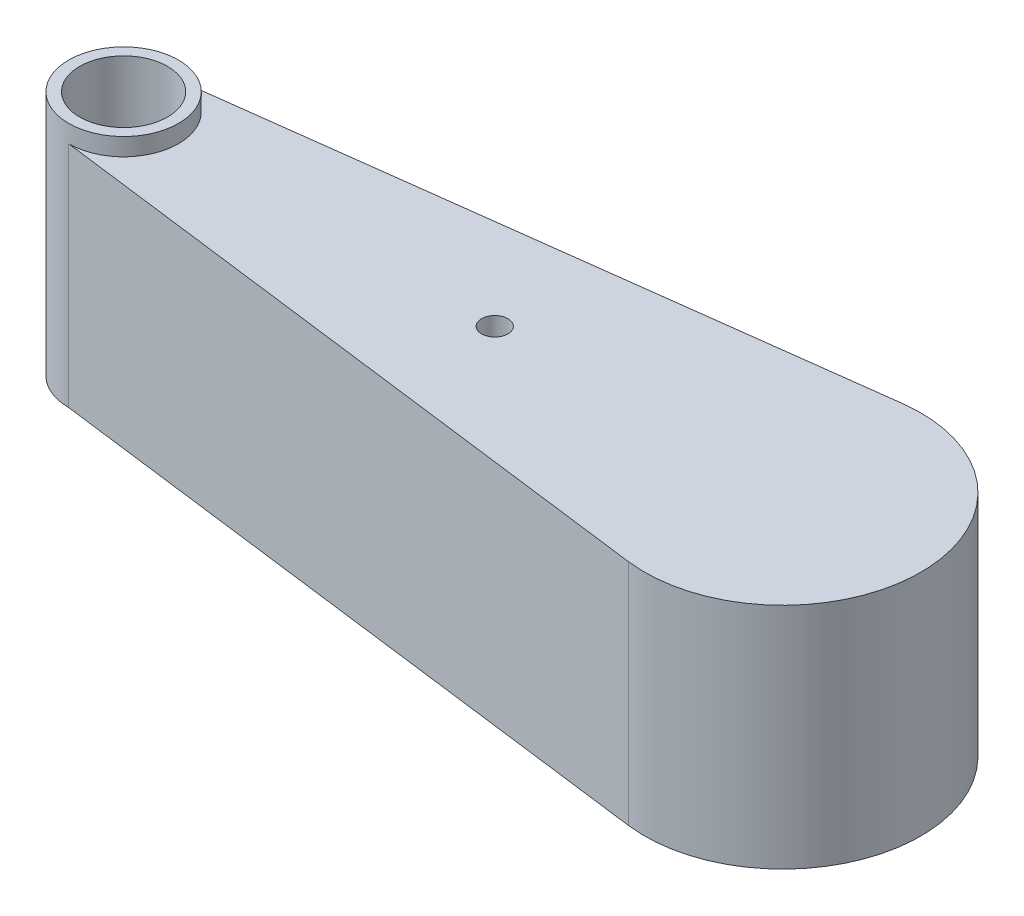
ISO-10303-21;
HEADER;
FILE_DESCRIPTION(('STEP AP214'),'2;1');
FILE_NAME('part.step','',(''),(''),'','','');
FILE_SCHEMA(('AUTOMOTIVE_DESIGN { 1 0 10303 214 1 1 1 1 }'));
ENDSEC;
DATA;
#1=APPLICATION_CONTEXT('core data for automotive mechanical design processes');
#2=APPLICATION_PROTOCOL_DEFINITION('international standard','automotive_design',2000,#1);
#3=PRODUCT_CONTEXT('',#1,'mechanical');
#4=PRODUCT('Part','Part','',(#3));
#5=PRODUCT_RELATED_PRODUCT_CATEGORY('part','',(#4));
#6=PRODUCT_DEFINITION_FORMATION('','',#4);
#7=PRODUCT_DEFINITION_CONTEXT('part definition',#1,'design');
#8=PRODUCT_DEFINITION('design','',#6,#7);
#9=PRODUCT_DEFINITION_SHAPE('','',#8);
#10=(LENGTH_UNIT() NAMED_UNIT(*) SI_UNIT(.MILLI.,.METRE.));
#11=(NAMED_UNIT(*) PLANE_ANGLE_UNIT() SI_UNIT($,.RADIAN.));
#12=(NAMED_UNIT(*) SI_UNIT($,.STERADIAN.) SOLID_ANGLE_UNIT());
#13=UNCERTAINTY_MEASURE_WITH_UNIT(LENGTH_MEASURE(1.E-05),#10,'distance_accuracy_value','');
#14=(GEOMETRIC_REPRESENTATION_CONTEXT(3) GLOBAL_UNCERTAINTY_ASSIGNED_CONTEXT((#13)) GLOBAL_UNIT_ASSIGNED_CONTEXT((#10,
#11,#12)) REPRESENTATION_CONTEXT('',''));
#15=CARTESIAN_POINT('',(0.,0.,0.));
#16=DIRECTION('',(0.,0.,1.));
#17=DIRECTION('',(1.,0.,0.));
#18=AXIS2_PLACEMENT_3D('',#15,#16,#17);
#19=CARTESIAN_POINT('',(55.4310193809195,26.,6.25));
#20=DIRECTION('',(0.,-1.,0.));
#21=DIRECTION('',(0.,0.,-1.));
#22=AXIS2_PLACEMENT_3D('',#19,#20,#21);
#23=PLANE('',#22);
#24=CARTESIAN_POINT('',(22.6607100556521,26.,6.25000000000001));
#25=DIRECTION('',(0.,1.,0.));
#26=DIRECTION('',(0.,0.,1.));
#27=AXIS2_PLACEMENT_3D('',#24,#25,#26);
#28=CIRCLE('',#27,1.5);
#29=CARTESIAN_POINT('',(22.6607100556521,26.,4.75000000000001));
#30=VERTEX_POINT('',#29);
#31=EDGE_CURVE('E101',#30,#30,#28,.T.);
#32=ORIENTED_EDGE('',*,*,#31,.F.);
#33=EDGE_LOOP('',(#32));
#34=FACE_BOUND('',#33,.T.);
#35=CARTESIAN_POINT('',(-19.5689806190805,26.,6.25));
#36=DIRECTION('',(0.,1.,0.));
#37=DIRECTION('',(0.,0.,1.));
#38=AXIS2_PLACEMENT_3D('',#35,#36,#37);
#39=CIRCLE('',#38,6.25);
#40=CARTESIAN_POINT('',(-19.5689806190805,26.,12.5));
#41=VERTEX_POINT('',#40);
#42=CARTESIAN_POINT('',(-19.5689806190805,26.,0.));
#43=VERTEX_POINT('',#42);
#44=EDGE_CURVE('E90',#41,#43,#39,.T.);
#45=ORIENTED_EDGE('',*,*,#44,.F.);
#46=DIRECTION('',(0.991928597676918,0.,0.126797701519795));
#47=VECTOR('',#46,1.);
#48=CARTESIAN_POINT('',(-19.5689806190805,26.,12.5));
#49=LINE('',#48,#47);
#50=CARTESIAN_POINT('',(53.4391059335093,26.,21.8325846123471));
#51=VERTEX_POINT('',#50);
#52=EDGE_CURVE('E51',#41,#51,#49,.T.);
#53=ORIENTED_EDGE('',*,*,#52,.T.);
#54=CARTESIAN_POINT('',(55.4310193809195,26.,6.25));
#55=DIRECTION('',(0.,1.,0.));
#56=DIRECTION('',(0.,0.,-1.));
#57=AXIS2_PLACEMENT_3D('',#54,#55,#56);
#58=CIRCLE('',#57,15.7093813494654);
#59=CARTESIAN_POINT('',(53.4391059335093,26.,-9.33258461234709));
#60=VERTEX_POINT('',#59);
#61=EDGE_CURVE('E110',#51,#60,#58,.T.);
#62=ORIENTED_EDGE('',*,*,#61,.T.);
#63=DIRECTION('',(-0.991928597676918,0.,0.126797701519795));
#64=VECTOR('',#63,1.);
#65=CARTESIAN_POINT('',(-19.5689806190805,26.,0.));
#66=LINE('',#65,#64);
#67=EDGE_CURVE('E80',#60,#43,#66,.T.);
#68=ORIENTED_EDGE('',*,*,#67,.T.);
#69=EDGE_LOOP('',(#45,#53,#62,#68));
#70=FACE_BOUND('',#69,.T.);
#71=ADVANCED_FACE('F34',(#34,#70),#23,.F.);
#72=CARTESIAN_POINT('',(55.4310193809195,0.,6.25));
#73=DIRECTION('',(0.,-1.,0.));
#74=DIRECTION('',(0.,0.,-1.));
#75=AXIS2_PLACEMENT_3D('',#72,#73,#74);
#76=PLANE('',#75);
#77=CARTESIAN_POINT('',(-19.5689806190805,0.,6.25));
#78=DIRECTION('',(0.,1.,0.));
#79=DIRECTION('',(0.,0.,1.));
#80=AXIS2_PLACEMENT_3D('',#77,#78,#79);
#81=CIRCLE('',#80,5.);
#82=CARTESIAN_POINT('',(-19.5689806190805,0.,1.25));
#83=VERTEX_POINT('',#82);
#84=EDGE_CURVE('E104',#83,#83,#81,.T.);
#85=ORIENTED_EDGE('',*,*,#84,.T.);
#86=EDGE_LOOP('',(#85));
#87=FACE_BOUND('',#86,.T.);
#88=CARTESIAN_POINT('',(55.4310193809195,0.,6.25));
#89=DIRECTION('',(0.,1.,0.));
#90=DIRECTION('',(0.,0.,-1.));
#91=AXIS2_PLACEMENT_3D('',#88,#89,#90);
#92=CIRCLE('',#91,15.7093813494654);
#93=CARTESIAN_POINT('',(53.4391059335093,0.,21.8325846123471));
#94=VERTEX_POINT('',#93);
#95=CARTESIAN_POINT('',(53.4391059335093,0.,-9.33258461234709));
#96=VERTEX_POINT('',#95);
#97=EDGE_CURVE('E109',#94,#96,#92,.T.);
#98=ORIENTED_EDGE('',*,*,#97,.F.);
#99=DIRECTION('',(0.991928597676918,0.,0.126797701519795));
#100=VECTOR('',#99,1.);
#101=CARTESIAN_POINT('',(-19.5689806190805,0.,12.5));
#102=LINE('',#101,#100);
#103=CARTESIAN_POINT('',(-19.5689806190805,0.,12.5));
#104=VERTEX_POINT('',#103);
#105=EDGE_CURVE('E75',#104,#94,#102,.T.);
#106=ORIENTED_EDGE('',*,*,#105,.F.);
#107=CARTESIAN_POINT('',(-19.5689806190805,0.,6.25));
#108=DIRECTION('',(0.,1.,0.));
#109=DIRECTION('',(0.,0.,1.));
#110=AXIS2_PLACEMENT_3D('',#107,#108,#109);
#111=CIRCLE('',#110,6.25);
#112=CARTESIAN_POINT('',(-19.5689806190805,0.,0.));
#113=VERTEX_POINT('',#112);
#114=EDGE_CURVE('E70',#113,#104,#111,.T.);
#115=ORIENTED_EDGE('',*,*,#114,.F.);
#116=DIRECTION('',(-0.991928597676918,0.,0.126797701519795));
#117=VECTOR('',#116,1.);
#118=CARTESIAN_POINT('',(-19.5689806190805,0.,0.));
#119=LINE('',#118,#117);
#120=EDGE_CURVE('E115',#96,#113,#119,.T.);
#121=ORIENTED_EDGE('',*,*,#120,.F.);
#122=EDGE_LOOP('',(#98,#106,#115,#121));
#123=FACE_BOUND('',#122,.T.);
#124=CARTESIAN_POINT('',(22.6607100556521,0.,6.25000000000001));
#125=DIRECTION('',(0.,1.,0.));
#126=DIRECTION('',(0.,0.,1.));
#127=AXIS2_PLACEMENT_3D('',#124,#125,#126);
#128=CIRCLE('',#127,1.5);
#129=CARTESIAN_POINT('',(22.6607100556521,0.,4.75000000000001));
#130=VERTEX_POINT('',#129);
#131=EDGE_CURVE('E96',#130,#130,#128,.T.);
#132=ORIENTED_EDGE('',*,*,#131,.T.);
#133=EDGE_LOOP('',(#132));
#134=FACE_BOUND('',#133,.T.);
#135=ADVANCED_FACE('F121',(#87,#123,#134),#76,.T.);
#136=CARTESIAN_POINT('',(55.4310193809195,26.,6.25));
#137=DIRECTION('',(0.,-1.,0.));
#138=DIRECTION('',(0.,0.,-1.));
#139=AXIS2_PLACEMENT_3D('',#136,#137,#138);
#140=CYLINDRICAL_SURFACE('',#139,15.7093813494654);
#141=ORIENTED_EDGE('',*,*,#97,.T.);
#142=DIRECTION('',(0.,-1.,0.));
#143=VECTOR('',#142,1.);
#144=CARTESIAN_POINT('',(53.4391059335093,26.,-9.33258461234709));
#145=LINE('',#144,#143);
#146=EDGE_CURVE('E11',#60,#96,#145,.T.);
#147=ORIENTED_EDGE('',*,*,#146,.F.);
#148=ORIENTED_EDGE('',*,*,#61,.F.);
#149=DIRECTION('',(0.,-1.,0.));
#150=VECTOR('',#149,1.);
#151=CARTESIAN_POINT('',(53.4391059335093,26.,21.8325846123471));
#152=LINE('',#151,#150);
#153=EDGE_CURVE('E84',#51,#94,#152,.T.);
#154=ORIENTED_EDGE('',*,*,#153,.T.);
#155=EDGE_LOOP('',(#141,#147,#148,#154));
#156=FACE_BOUND('',#155,.T.);
#157=ADVANCED_FACE('F36',(#156),#140,.T.);
#158=CARTESIAN_POINT('',(-19.5689806190805,26.,0.));
#159=DIRECTION('',(0.126797701519795,0.,0.991928597676918));
#160=DIRECTION('',(0.991928597676918,0.,-0.126797701519795));
#161=AXIS2_PLACEMENT_3D('',#158,#159,#160);
#162=PLANE('',#161);
#163=ORIENTED_EDGE('',*,*,#120,.T.);
#164=DIRECTION('',(0.,-1.,0.));
#165=VECTOR('',#164,1.);
#166=CARTESIAN_POINT('',(-19.5689806190805,26.,0.));
#167=LINE('',#166,#165);
#168=EDGE_CURVE('E43',#43,#113,#167,.T.);
#169=ORIENTED_EDGE('',*,*,#168,.F.);
#170=ORIENTED_EDGE('',*,*,#67,.F.);
#171=ORIENTED_EDGE('',*,*,#146,.T.);
#172=EDGE_LOOP('',(#163,#169,#170,#171));
#173=FACE_BOUND('',#172,.T.);
#174=ADVANCED_FACE('F125',(#173),#162,.F.);
#175=CARTESIAN_POINT('',(-19.5689806190805,26.,6.25));
#176=DIRECTION('',(0.,-1.,0.));
#177=DIRECTION('',(0.,0.,-1.));
#178=AXIS2_PLACEMENT_3D('',#175,#176,#177);
#179=CYLINDRICAL_SURFACE('',#178,6.25);
#180=ORIENTED_EDGE('',*,*,#114,.T.);
#181=DIRECTION('',(0.,-1.,0.));
#182=VECTOR('',#181,1.);
#183=CARTESIAN_POINT('',(-19.5689806190805,26.,12.5));
#184=LINE('',#183,#182);
#185=EDGE_CURVE('E83',#41,#104,#184,.T.);
#186=ORIENTED_EDGE('',*,*,#185,.F.);
#187=ORIENTED_EDGE('',*,*,#44,.T.);
#188=ORIENTED_EDGE('',*,*,#168,.T.);
#189=EDGE_LOOP('',(#180,#186,#187,#188));
#190=FACE_BOUND('',#189,.T.);
#191=CARTESIAN_POINT('',(-19.5689806190805,28.,6.25));
#192=DIRECTION('',(0.,1.,0.));
#193=DIRECTION('',(0.,0.,1.));
#194=AXIS2_PLACEMENT_3D('',#191,#192,#193);
#195=CIRCLE('',#194,6.25);
#196=CARTESIAN_POINT('',(-19.5689806190805,28.,12.5));
#197=VERTEX_POINT('',#196);
#198=EDGE_CURVE('E92',#197,#197,#195,.T.);
#199=ORIENTED_EDGE('',*,*,#198,.F.);
#200=EDGE_LOOP('',(#199));
#201=FACE_BOUND('',#200,.T.);
#202=ADVANCED_FACE('F88',(#190,#201),#179,.T.);
#203=CARTESIAN_POINT('',(-19.5689806190805,26.,12.5));
#204=DIRECTION('',(0.126797701519795,0.,-0.991928597676918));
#205=DIRECTION('',(-0.991928597676918,0.,-0.126797701519795));
#206=AXIS2_PLACEMENT_3D('',#203,#204,#205);
#207=PLANE('',#206);
#208=ORIENTED_EDGE('',*,*,#105,.T.);
#209=ORIENTED_EDGE('',*,*,#153,.F.);
#210=ORIENTED_EDGE('',*,*,#52,.F.);
#211=ORIENTED_EDGE('',*,*,#185,.T.);
#212=EDGE_LOOP('',(#208,#209,#210,#211));
#213=FACE_BOUND('',#212,.T.);
#214=ADVANCED_FACE('F82',(#213),#207,.F.);
#215=CARTESIAN_POINT('',(-19.5689806190805,26.,6.25));
#216=DIRECTION('',(0.,-1.,0.));
#217=DIRECTION('',(0.,0.,-1.));
#218=AXIS2_PLACEMENT_3D('',#215,#216,#217);
#219=CYLINDRICAL_SURFACE('',#218,5.);
#220=CARTESIAN_POINT('',(-19.5689806190805,28.,6.25));
#221=DIRECTION('',(0.,1.,0.));
#222=DIRECTION('',(0.,0.,1.));
#223=AXIS2_PLACEMENT_3D('',#220,#221,#222);
#224=CIRCLE('',#223,5.);
#225=CARTESIAN_POINT('',(-19.5689806190805,28.,1.25));
#226=VERTEX_POINT('',#225);
#227=EDGE_CURVE('E93',#226,#226,#224,.T.);
#228=CARTESIAN_POINT('',(-19.5689806190805,0.,1.25));
#229=CARTESIAN_POINT('',(-19.5689806190805,0.291666666666666,1.25));
#230=CARTESIAN_POINT('',(-19.5689806190805,0.583333333333334,1.25));
#231=CARTESIAN_POINT('',(-19.5689806190805,1.16666666666667,1.25));
#232=CARTESIAN_POINT('',(-19.5689806190805,1.45833333333333,1.25));
#233=CARTESIAN_POINT('',(-19.5689806190805,2.04166666666667,1.25));
#234=CARTESIAN_POINT('',(-19.5689806190805,2.33333333333333,1.25));
#235=CARTESIAN_POINT('',(-19.5689806190805,2.91666666666667,1.25));
#236=CARTESIAN_POINT('',(-19.5689806190805,3.20833333333333,1.25));
#237=CARTESIAN_POINT('',(-19.5689806190805,3.79166666666667,1.25));
#238=CARTESIAN_POINT('',(-19.5689806190805,4.08333333333333,1.25));
#239=CARTESIAN_POINT('',(-19.5689806190805,4.66666666666667,1.25));
#240=CARTESIAN_POINT('',(-19.5689806190805,4.95833333333333,1.25));
#241=CARTESIAN_POINT('',(-19.5689806190805,5.54166666666666,1.25));
#242=CARTESIAN_POINT('',(-19.5689806190805,5.83333333333333,1.25));
#243=CARTESIAN_POINT('',(-19.5689806190805,6.41666666666667,1.25));
#244=CARTESIAN_POINT('',(-19.5689806190805,6.70833333333333,1.25));
#245=CARTESIAN_POINT('',(-19.5689806190805,7.29166666666667,1.25));
#246=CARTESIAN_POINT('',(-19.5689806190805,7.58333333333333,1.25));
#247=CARTESIAN_POINT('',(-19.5689806190805,8.16666666666667,1.25));
#248=CARTESIAN_POINT('',(-19.5689806190805,8.45833333333333,1.25));
#249=CARTESIAN_POINT('',(-19.5689806190805,9.04166666666667,1.25));
#250=CARTESIAN_POINT('',(-19.5689806190805,9.33333333333333,1.25));
#251=CARTESIAN_POINT('',(-19.5689806190805,9.91666666666666,1.25));
#252=CARTESIAN_POINT('',(-19.5689806190805,10.2083333333333,1.25));
#253=CARTESIAN_POINT('',(-19.5689806190805,10.7916666666667,1.25));
#254=CARTESIAN_POINT('',(-19.5689806190805,11.0833333333333,1.25));
#255=CARTESIAN_POINT('',(-19.5689806190805,11.6666666666667,1.25));
#256=CARTESIAN_POINT('',(-19.5689806190805,11.9583333333333,1.25));
#257=CARTESIAN_POINT('',(-19.5689806190805,12.5416666666667,1.25));
#258=CARTESIAN_POINT('',(-19.5689806190805,12.8333333333333,1.25));
#259=CARTESIAN_POINT('',(-19.5689806190805,13.4166666666667,1.25));
#260=CARTESIAN_POINT('',(-19.5689806190805,13.7083333333333,1.25));
#261=CARTESIAN_POINT('',(-19.5689806190805,14.2916666666667,1.25));
#262=CARTESIAN_POINT('',(-19.5689806190805,14.5833333333333,1.25));
#263=CARTESIAN_POINT('',(-19.5689806190805,15.1666666666667,1.25));
#264=CARTESIAN_POINT('',(-19.5689806190805,15.4583333333333,1.25));
#265=CARTESIAN_POINT('',(-19.5689806190805,16.0416666666667,1.25));
#266=CARTESIAN_POINT('',(-19.5689806190805,16.3333333333333,1.25));
#267=CARTESIAN_POINT('',(-19.5689806190805,16.9166666666667,1.25));
#268=CARTESIAN_POINT('',(-19.5689806190805,17.2083333333333,1.25));
#269=CARTESIAN_POINT('',(-19.5689806190805,17.7916666666667,1.25));
#270=CARTESIAN_POINT('',(-19.5689806190805,18.0833333333333,1.25));
#271=CARTESIAN_POINT('',(-19.5689806190805,18.6666666666667,1.25));
#272=CARTESIAN_POINT('',(-19.5689806190805,18.9583333333333,1.25));
#273=CARTESIAN_POINT('',(-19.5689806190805,19.5416666666667,1.25));
#274=CARTESIAN_POINT('',(-19.5689806190805,19.8333333333333,1.25));
#275=CARTESIAN_POINT('',(-19.5689806190805,20.4166666666667,1.25));
#276=CARTESIAN_POINT('',(-19.5689806190805,20.7083333333333,1.25));
#277=CARTESIAN_POINT('',(-19.5689806190805,21.2916666666667,1.25));
#278=CARTESIAN_POINT('',(-19.5689806190805,21.5833333333333,1.25));
#279=CARTESIAN_POINT('',(-19.5689806190805,22.1666666666667,1.25));
#280=CARTESIAN_POINT('',(-19.5689806190805,22.4583333333333,1.25));
#281=CARTESIAN_POINT('',(-19.5689806190805,23.0416666666667,1.25));
#282=CARTESIAN_POINT('',(-19.5689806190805,23.3333333333333,1.25));
#283=CARTESIAN_POINT('',(-19.5689806190805,23.9166666666667,1.25));
#284=CARTESIAN_POINT('',(-19.5689806190805,24.2083333333333,1.25));
#285=CARTESIAN_POINT('',(-19.5689806190805,24.7916666666667,1.25));
#286=CARTESIAN_POINT('',(-19.5689806190805,25.0833333333333,1.25));
#287=CARTESIAN_POINT('',(-19.5689806190805,25.6666666666667,1.25));
#288=CARTESIAN_POINT('',(-19.5689806190805,25.9583333333333,1.25));
#289=CARTESIAN_POINT('',(-19.5689806190805,26.5416666666667,1.25));
#290=CARTESIAN_POINT('',(-19.5689806190805,26.8333333333333,1.25));
#291=CARTESIAN_POINT('',(-19.5689806190805,27.4166666666667,1.25));
#292=CARTESIAN_POINT('',(-19.5689806190805,27.7083333333333,1.25));
#293=CARTESIAN_POINT('',(-19.5689806190805,28.,1.25));
#294=B_SPLINE_CURVE_WITH_KNOTS('',3,(#228,#229,#230,#231,#232,#233,#234,#235,#236,#237,#238,
#239,#240,#241,#242,#243,#244,#245,#246,#247,#248,#249,#250,#251,#252,#253,#254,#255,#256,#257,
#258,#259,#260,#261,#262,#263,#264,#265,#266,#267,#268,#269,#270,#271,#272,#273,#274,#275,#276,
#277,#278,#279,#280,#281,#282,#283,#284,#285,#286,#287,#288,#289,#290,#291,#292,#293),
.UNSPECIFIED.,.F.,.F.,(4,2,2,2,2,2,2,2,2,2,2,2,2,2,2,2,2,2,2,2,2,2,2,2,2,2,2,2,2,2,2,2,4),(0.,
0.875000000000001,1.75,2.625,3.5,4.375,5.25,6.125,7.,7.875,8.75,9.625,10.5,11.375,12.25,13.125,
14.,14.875,15.75,16.625,17.5,18.375,19.25,20.125,21.,21.875,22.75,23.625,24.5,25.375,26.25,
27.125,28.),.UNSPECIFIED.);
#295=EDGE_CURVE('BSEAM142',#83,#226,#294,.T.);
#296=ORIENTED_EDGE('',*,*,#84,.F.);
#297=ORIENTED_EDGE('',*,*,#227,.T.);
#298=ORIENTED_EDGE('',*,*,#295,.T.);
#299=ORIENTED_EDGE('',*,*,#295,.F.);
#300=EDGE_LOOP('',(#296,#298,#297,#299));
#301=FACE_BOUND('',#300,.T.);
#302=ADVANCED_FACE('F142',(#301),#219,.F.);
#303=CARTESIAN_POINT('',(22.6607100556521,26.,6.25000000000001));
#304=DIRECTION('',(0.,-1.,0.));
#305=DIRECTION('',(0.,0.,-1.));
#306=AXIS2_PLACEMENT_3D('',#303,#304,#305);
#307=CYLINDRICAL_SURFACE('',#306,1.5);
#308=CARTESIAN_POINT('',(22.6607100556521,26.,4.75000000000001));
#309=CARTESIAN_POINT('',(22.6607100556521,25.7291666666667,4.75000000000001));
#310=CARTESIAN_POINT('',(22.6607100556521,25.4583333333333,4.75000000000001));
#311=CARTESIAN_POINT('',(22.6607100556521,24.9166666666667,4.75000000000001));
#312=CARTESIAN_POINT('',(22.6607100556521,24.6458333333333,4.75000000000001));
#313=CARTESIAN_POINT('',(22.6607100556521,24.1041666666667,4.75000000000001));
#314=CARTESIAN_POINT('',(22.6607100556521,23.8333333333333,4.75000000000001));
#315=CARTESIAN_POINT('',(22.6607100556521,23.2916666666667,4.75000000000001));
#316=CARTESIAN_POINT('',(22.6607100556521,23.0208333333333,4.75000000000001));
#317=CARTESIAN_POINT('',(22.6607100556521,22.4791666666667,4.75000000000001));
#318=CARTESIAN_POINT('',(22.6607100556521,22.2083333333333,4.75000000000001));
#319=CARTESIAN_POINT('',(22.6607100556521,21.6666666666667,4.75000000000001));
#320=CARTESIAN_POINT('',(22.6607100556521,21.3958333333333,4.75000000000001));
#321=CARTESIAN_POINT('',(22.6607100556521,20.8541666666667,4.75000000000001));
#322=CARTESIAN_POINT('',(22.6607100556521,20.5833333333333,4.75000000000001));
#323=CARTESIAN_POINT('',(22.6607100556521,20.0416666666667,4.75000000000001));
#324=CARTESIAN_POINT('',(22.6607100556521,19.7708333333333,4.75000000000001));
#325=CARTESIAN_POINT('',(22.6607100556521,19.2291666666667,4.75000000000001));
#326=CARTESIAN_POINT('',(22.6607100556521,18.9583333333333,4.75000000000001));
#327=CARTESIAN_POINT('',(22.6607100556521,18.4166666666667,4.75000000000001));
#328=CARTESIAN_POINT('',(22.6607100556521,18.1458333333333,4.75000000000001));
#329=CARTESIAN_POINT('',(22.6607100556521,17.6041666666667,4.75000000000001));
#330=CARTESIAN_POINT('',(22.6607100556521,17.3333333333333,4.75000000000001));
#331=CARTESIAN_POINT('',(22.6607100556521,16.7916666666667,4.75000000000001));
#332=CARTESIAN_POINT('',(22.6607100556521,16.5208333333333,4.75000000000001));
#333=CARTESIAN_POINT('',(22.6607100556521,15.9791666666667,4.75000000000001));
#334=CARTESIAN_POINT('',(22.6607100556521,15.7083333333333,4.75000000000001));
#335=CARTESIAN_POINT('',(22.6607100556521,15.1666666666667,4.75000000000001));
#336=CARTESIAN_POINT('',(22.6607100556521,14.8958333333333,4.75000000000001));
#337=CARTESIAN_POINT('',(22.6607100556521,14.3541666666667,4.75000000000001));
#338=CARTESIAN_POINT('',(22.6607100556521,14.0833333333333,4.75000000000001));
#339=CARTESIAN_POINT('',(22.6607100556521,13.5416666666667,4.75000000000001));
#340=CARTESIAN_POINT('',(22.6607100556521,13.2708333333333,4.75000000000001));
#341=CARTESIAN_POINT('',(22.6607100556521,12.7291666666667,4.75000000000001));
#342=CARTESIAN_POINT('',(22.6607100556521,12.4583333333333,4.75000000000001));
#343=CARTESIAN_POINT('',(22.6607100556521,11.9166666666667,4.75000000000001));
#344=CARTESIAN_POINT('',(22.6607100556521,11.6458333333333,4.75000000000001));
#345=CARTESIAN_POINT('',(22.6607100556521,11.1041666666667,4.75000000000001));
#346=CARTESIAN_POINT('',(22.6607100556521,10.8333333333333,4.75000000000001));
#347=CARTESIAN_POINT('',(22.6607100556521,10.2916666666667,4.75000000000001));
#348=CARTESIAN_POINT('',(22.6607100556521,10.0208333333333,4.75000000000001));
#349=CARTESIAN_POINT('',(22.6607100556521,9.47916666666667,4.75000000000001));
#350=CARTESIAN_POINT('',(22.6607100556521,9.20833333333333,4.75000000000001));
#351=CARTESIAN_POINT('',(22.6607100556521,8.66666666666667,4.75000000000001));
#352=CARTESIAN_POINT('',(22.6607100556521,8.39583333333333,4.75000000000001));
#353=CARTESIAN_POINT('',(22.6607100556521,7.85416666666667,4.75000000000001));
#354=CARTESIAN_POINT('',(22.6607100556521,7.58333333333333,4.75000000000001));
#355=CARTESIAN_POINT('',(22.6607100556521,7.04166666666667,4.75000000000001));
#356=CARTESIAN_POINT('',(22.6607100556521,6.77083333333333,4.75000000000001));
#357=CARTESIAN_POINT('',(22.6607100556521,6.22916666666667,4.75000000000001));
#358=CARTESIAN_POINT('',(22.6607100556521,5.95833333333333,4.75000000000001));
#359=CARTESIAN_POINT('',(22.6607100556521,5.41666666666667,4.75000000000001));
#360=CARTESIAN_POINT('',(22.6607100556521,5.14583333333333,4.75000000000001));
#361=CARTESIAN_POINT('',(22.6607100556521,4.60416666666667,4.75000000000001));
#362=CARTESIAN_POINT('',(22.6607100556521,4.33333333333333,4.75000000000001));
#363=CARTESIAN_POINT('',(22.6607100556521,3.79166666666667,4.75000000000001));
#364=CARTESIAN_POINT('',(22.6607100556521,3.52083333333333,4.75000000000001));
#365=CARTESIAN_POINT('',(22.6607100556521,2.97916666666667,4.75000000000001));
#366=CARTESIAN_POINT('',(22.6607100556521,2.70833333333333,4.75000000000001));
#367=CARTESIAN_POINT('',(22.6607100556521,2.16666666666667,4.75000000000001));
#368=CARTESIAN_POINT('',(22.6607100556521,1.89583333333333,4.75000000000001));
#369=CARTESIAN_POINT('',(22.6607100556521,1.35416666666667,4.75000000000001));
#370=CARTESIAN_POINT('',(22.6607100556521,1.08333333333333,4.75000000000001));
#371=CARTESIAN_POINT('',(22.6607100556521,0.541666666666667,4.75000000000001));
#372=CARTESIAN_POINT('',(22.6607100556521,0.270833333333334,4.75000000000001));
#373=CARTESIAN_POINT('',(22.6607100556521,0.,4.75000000000001));
#374=B_SPLINE_CURVE_WITH_KNOTS('',3,(#308,#309,#310,#311,#312,#313,#314,#315,#316,#317,#318,
#319,#320,#321,#322,#323,#324,#325,#326,#327,#328,#329,#330,#331,#332,#333,#334,#335,#336,#337,
#338,#339,#340,#341,#342,#343,#344,#345,#346,#347,#348,#349,#350,#351,#352,#353,#354,#355,#356,
#357,#358,#359,#360,#361,#362,#363,#364,#365,#366,#367,#368,#369,#370,#371,#372,#373),
.UNSPECIFIED.,.F.,.F.,(4,2,2,2,2,2,2,2,2,2,2,2,2,2,2,2,2,2,2,2,2,2,2,2,2,2,2,2,2,2,2,2,4),(0.,
0.812500000000001,1.625,2.4375,3.25,4.0625,4.875,5.6875,6.5,7.3125,8.125,8.9375,9.75,10.5625,
11.375,12.1875,13.,13.8125,14.625,15.4375,16.25,17.0625,17.875,18.6875,19.5,20.3125,21.125,
21.9375,22.75,23.5625,24.375,25.1875,26.),.UNSPECIFIED.);
#375=EDGE_CURVE('BSEAM149',#30,#130,#374,.T.);
#376=ORIENTED_EDGE('',*,*,#31,.T.);
#377=ORIENTED_EDGE('',*,*,#131,.F.);
#378=ORIENTED_EDGE('',*,*,#375,.T.);
#379=ORIENTED_EDGE('',*,*,#375,.F.);
#380=EDGE_LOOP('',(#376,#378,#377,#379));
#381=FACE_BOUND('',#380,.T.);
#382=ADVANCED_FACE('F149',(#381),#307,.F.);
#383=CARTESIAN_POINT('',(-19.5689806190805,28.,6.25));
#384=DIRECTION('',(0.,1.,0.));
#385=DIRECTION('',(0.,0.,1.));
#386=AXIS2_PLACEMENT_3D('',#383,#384,#385);
#387=PLANE('',#386);
#388=ORIENTED_EDGE('',*,*,#227,.F.);
#389=EDGE_LOOP('',(#388));
#390=FACE_BOUND('',#389,.T.);
#391=ORIENTED_EDGE('',*,*,#198,.T.);
#392=EDGE_LOOP('',(#391));
#393=FACE_BOUND('',#392,.T.);
#394=ADVANCED_FACE('F154',(#390,#393),#387,.T.);
#395=CLOSED_SHELL('',(#71,#135,#157,#174,#202,#214,#302,#382,#394));
#396=MANIFOLD_SOLID_BREP('B2',#395);
#397=ADVANCED_BREP_SHAPE_REPRESENTATION('',(#18,#396),#14);
#398=SHAPE_DEFINITION_REPRESENTATION(#9,#397);
ENDSEC;
END-ISO-10303-21;
